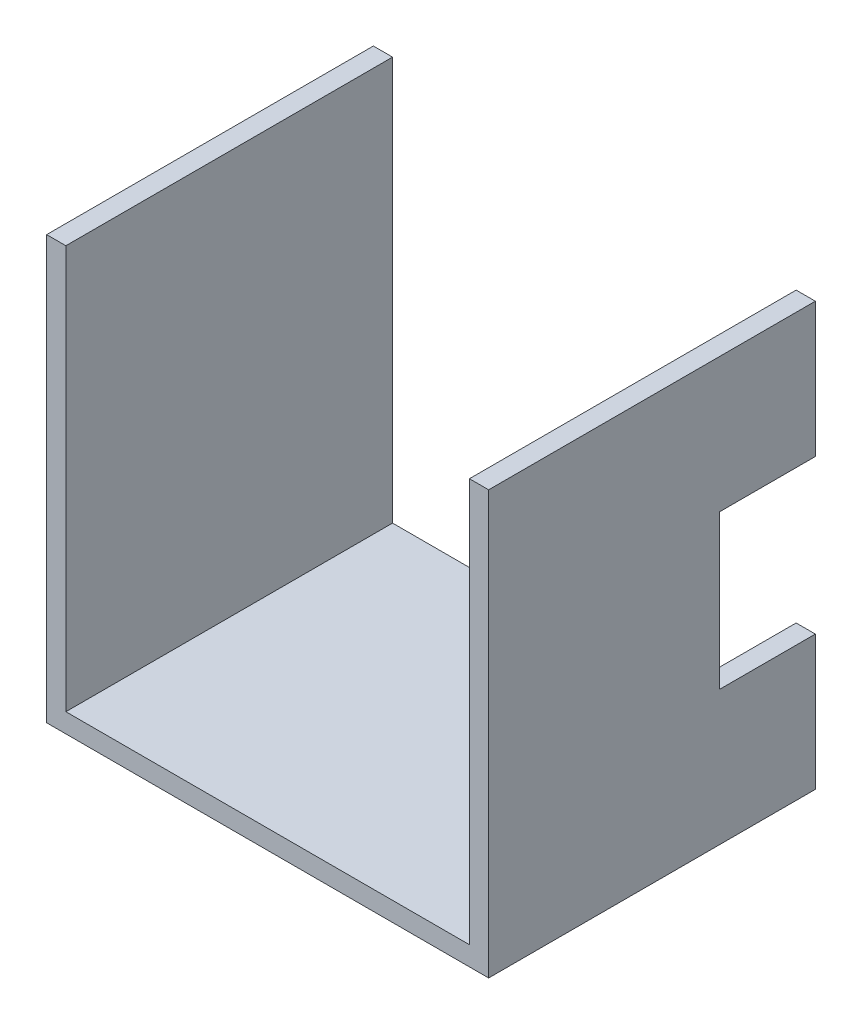
ISO-10303-21;
HEADER;
FILE_DESCRIPTION(('STEP AP214'),'2;1');
FILE_NAME('part.step','',(''),(''),'','','');
FILE_SCHEMA(('AUTOMOTIVE_DESIGN { 1 0 10303 214 1 1 1 1 }'));
ENDSEC;
DATA;
#1=APPLICATION_CONTEXT('core data for automotive mechanical design processes');
#2=APPLICATION_PROTOCOL_DEFINITION('international standard','automotive_design',2000,#1);
#3=PRODUCT_CONTEXT('',#1,'mechanical');
#4=PRODUCT('Part','Part','',(#3));
#5=PRODUCT_RELATED_PRODUCT_CATEGORY('part','',(#4));
#6=PRODUCT_DEFINITION_FORMATION('','',#4);
#7=PRODUCT_DEFINITION_CONTEXT('part definition',#1,'design');
#8=PRODUCT_DEFINITION('design','',#6,#7);
#9=PRODUCT_DEFINITION_SHAPE('','',#8);
#10=(LENGTH_UNIT() NAMED_UNIT(*) SI_UNIT(.MILLI.,.METRE.));
#11=(NAMED_UNIT(*) PLANE_ANGLE_UNIT() SI_UNIT($,.RADIAN.));
#12=(NAMED_UNIT(*) SI_UNIT($,.STERADIAN.) SOLID_ANGLE_UNIT());
#13=UNCERTAINTY_MEASURE_WITH_UNIT(LENGTH_MEASURE(1.E-05),#10,'distance_accuracy_value','');
#14=(GEOMETRIC_REPRESENTATION_CONTEXT(3) GLOBAL_UNCERTAINTY_ASSIGNED_CONTEXT((#13)) GLOBAL_UNIT_ASSIGNED_CONTEXT((#10,
#11,#12)) REPRESENTATION_CONTEXT('',''));
#15=CARTESIAN_POINT('',(0.,0.,0.));
#16=DIRECTION('',(0.,0.,1.));
#17=DIRECTION('',(1.,0.,0.));
#18=AXIS2_PLACEMENT_3D('',#15,#16,#17);
#19=CARTESIAN_POINT('',(0.,0.,0.));
#20=DIRECTION('',(0.,0.,1.));
#21=DIRECTION('',(1.,0.,0.));
#22=AXIS2_PLACEMENT_3D('',#19,#20,#21);
#23=PLANE('',#22);
#24=DIRECTION('',(0.,1.,0.));
#25=VECTOR('',#24,1.);
#26=CARTESIAN_POINT('',(44.,-1.99999999999999,0.));
#27=LINE('',#26,#25);
#28=CARTESIAN_POINT('',(44.,28.,0.));
#29=VERTEX_POINT('',#28);
#30=CARTESIAN_POINT('',(44.,42.,0.));
#31=VERTEX_POINT('',#30);
#32=EDGE_CURVE('E172',#29,#31,#27,.T.);
#33=ORIENTED_EDGE('',*,*,#32,.F.);
#34=DIRECTION('',(1.,0.,0.));
#35=VECTOR('',#34,1.);
#36=CARTESIAN_POINT('',(42.,28.,0.));
#37=LINE('',#36,#35);
#38=CARTESIAN_POINT('',(42.,28.,0.));
#39=VERTEX_POINT('',#38);
#40=EDGE_CURVE('E163',#39,#29,#37,.T.);
#41=ORIENTED_EDGE('',*,*,#40,.F.);
#42=DIRECTION('',(0.,-1.,0.));
#43=VECTOR('',#42,1.);
#44=CARTESIAN_POINT('',(42.,0.,0.));
#45=LINE('',#44,#43);
#46=CARTESIAN_POINT('',(42.,42.,0.));
#47=VERTEX_POINT('',#46);
#48=EDGE_CURVE('E180',#47,#39,#45,.T.);
#49=ORIENTED_EDGE('',*,*,#48,.F.);
#50=DIRECTION('',(-1.,0.,0.));
#51=VECTOR('',#50,1.);
#52=CARTESIAN_POINT('',(44.,42.,0.));
#53=LINE('',#52,#51);
#54=EDGE_CURVE('E142',#31,#47,#53,.T.);
#55=ORIENTED_EDGE('',*,*,#54,.F.);
#56=EDGE_LOOP('',(#33,#41,#49,#55));
#57=FACE_BOUND('',#56,.T.);
#58=ADVANCED_FACE('F43',(#57),#23,.F.);
#59=CARTESIAN_POINT('',(0.,0.,34.));
#60=DIRECTION('',(-1.,0.,0.));
#61=DIRECTION('',(0.,0.,1.));
#62=AXIS2_PLACEMENT_3D('',#59,#60,#61);
#63=PLANE('',#62);
#64=DIRECTION('',(0.,1.,0.));
#65=VECTOR('',#64,1.);
#66=CARTESIAN_POINT('',(0.,0.,0.));
#67=LINE('',#66,#65);
#68=CARTESIAN_POINT('',(0.,0.,0.));
#69=VERTEX_POINT('',#68);
#70=CARTESIAN_POINT('',(0.,42.,0.));
#71=VERTEX_POINT('',#70);
#72=EDGE_CURVE('E158',#69,#71,#67,.T.);
#73=ORIENTED_EDGE('',*,*,#72,.T.);
#74=DIRECTION('',(0.,0.,-1.));
#75=VECTOR('',#74,1.);
#76=CARTESIAN_POINT('',(0.,42.,34.));
#77=LINE('',#76,#75);
#78=CARTESIAN_POINT('',(0.,42.,34.));
#79=VERTEX_POINT('',#78);
#80=EDGE_CURVE('E11',#79,#71,#77,.T.);
#81=ORIENTED_EDGE('',*,*,#80,.F.);
#82=DIRECTION('',(0.,1.,0.));
#83=VECTOR('',#82,1.);
#84=CARTESIAN_POINT('',(0.,0.,34.));
#85=LINE('',#84,#83);
#86=CARTESIAN_POINT('',(0.,0.,34.));
#87=VERTEX_POINT('',#86);
#88=EDGE_CURVE('E185',#87,#79,#85,.T.);
#89=ORIENTED_EDGE('',*,*,#88,.F.);
#90=DIRECTION('',(0.,0.,-1.));
#91=VECTOR('',#90,1.);
#92=CARTESIAN_POINT('',(0.,0.,34.));
#93=LINE('',#92,#91);
#94=EDGE_CURVE('E154',#87,#69,#93,.T.);
#95=ORIENTED_EDGE('',*,*,#94,.T.);
#96=EDGE_LOOP('',(#73,#81,#89,#95));
#97=FACE_BOUND('',#96,.T.);
#98=ADVANCED_FACE('F45',(#97),#63,.F.);
#99=CARTESIAN_POINT('',(0.,42.,34.));
#100=DIRECTION('',(0.,-1.,0.));
#101=DIRECTION('',(0.,0.,-1.));
#102=AXIS2_PLACEMENT_3D('',#99,#100,#101);
#103=PLANE('',#102);
#104=DIRECTION('',(-1.,0.,0.));
#105=VECTOR('',#104,1.);
#106=CARTESIAN_POINT('',(0.,42.,0.));
#107=LINE('',#106,#105);
#108=CARTESIAN_POINT('',(-2.,42.,0.));
#109=VERTEX_POINT('',#108);
#110=EDGE_CURVE('E162',#71,#109,#107,.T.);
#111=ORIENTED_EDGE('',*,*,#110,.T.);
#112=DIRECTION('',(0.,0.,-1.));
#113=VECTOR('',#112,1.);
#114=CARTESIAN_POINT('',(-2.,42.,34.));
#115=LINE('',#114,#113);
#116=CARTESIAN_POINT('',(-2.,42.,34.));
#117=VERTEX_POINT('',#116);
#118=EDGE_CURVE('E52',#117,#109,#115,.T.);
#119=ORIENTED_EDGE('',*,*,#118,.F.);
#120=DIRECTION('',(-1.,0.,0.));
#121=VECTOR('',#120,1.);
#122=CARTESIAN_POINT('',(0.,42.,34.));
#123=LINE('',#122,#121);
#124=EDGE_CURVE('E109',#79,#117,#123,.T.);
#125=ORIENTED_EDGE('',*,*,#124,.F.);
#126=ORIENTED_EDGE('',*,*,#80,.T.);
#127=EDGE_LOOP('',(#111,#119,#125,#126));
#128=FACE_BOUND('',#127,.T.);
#129=ADVANCED_FACE('F287',(#128),#103,.F.);
#130=CARTESIAN_POINT('',(-2.,42.,34.));
#131=DIRECTION('',(1.,0.,0.));
#132=DIRECTION('',(0.,1.,0.));
#133=AXIS2_PLACEMENT_3D('',#130,#131,#132);
#134=PLANE('',#133);
#135=DIRECTION('',(0.,-1.,0.));
#136=VECTOR('',#135,1.);
#137=CARTESIAN_POINT('',(-2.,42.,0.));
#138=LINE('',#137,#136);
#139=CARTESIAN_POINT('',(-1.99999999999999,-1.99999999999999,0.));
#140=VERTEX_POINT('',#139);
#141=EDGE_CURVE('E166',#109,#140,#138,.T.);
#142=ORIENTED_EDGE('',*,*,#141,.T.);
#143=DIRECTION('',(0.,0.,-1.));
#144=VECTOR('',#143,1.);
#145=CARTESIAN_POINT('',(-1.99999999999999,-1.99999999999999,34.));
#146=LINE('',#145,#144);
#147=CARTESIAN_POINT('',(-1.99999999999999,-1.99999999999999,34.));
#148=VERTEX_POINT('',#147);
#149=EDGE_CURVE('E196',#148,#140,#146,.T.);
#150=ORIENTED_EDGE('',*,*,#149,.F.);
#151=DIRECTION('',(0.,-1.,0.));
#152=VECTOR('',#151,1.);
#153=CARTESIAN_POINT('',(-2.,42.,34.));
#154=LINE('',#153,#152);
#155=EDGE_CURVE('E206',#117,#148,#154,.T.);
#156=ORIENTED_EDGE('',*,*,#155,.F.);
#157=ORIENTED_EDGE('',*,*,#118,.T.);
#158=EDGE_LOOP('',(#142,#150,#156,#157));
#159=FACE_BOUND('',#158,.T.);
#160=ADVANCED_FACE('F204',(#159),#134,.F.);
#161=CARTESIAN_POINT('',(-1.99999999999999,-1.99999999999999,34.));
#162=DIRECTION('',(0.,1.,0.));
#163=DIRECTION('',(-1.,0.,0.));
#164=AXIS2_PLACEMENT_3D('',#161,#162,#163);
#165=PLANE('',#164);
#166=DIRECTION('',(1.,0.,0.));
#167=VECTOR('',#166,1.);
#168=CARTESIAN_POINT('',(-1.99999999999999,-1.99999999999999,0.));
#169=LINE('',#168,#167);
#170=CARTESIAN_POINT('',(44.,-1.99999999999999,0.));
#171=VERTEX_POINT('',#170);
#172=EDGE_CURVE('E169',#140,#171,#169,.T.);
#173=ORIENTED_EDGE('',*,*,#172,.T.);
#174=DIRECTION('',(0.,0.,-1.));
#175=VECTOR('',#174,1.);
#176=CARTESIAN_POINT('',(44.,-1.99999999999999,34.));
#177=LINE('',#176,#175);
#178=CARTESIAN_POINT('',(44.,-1.99999999999999,34.));
#179=VERTEX_POINT('',#178);
#180=EDGE_CURVE('E192',#179,#171,#177,.T.);
#181=ORIENTED_EDGE('',*,*,#180,.F.);
#182=DIRECTION('',(1.,0.,0.));
#183=VECTOR('',#182,1.);
#184=CARTESIAN_POINT('',(-1.99999999999999,-1.99999999999999,34.));
#185=LINE('',#184,#183);
#186=EDGE_CURVE('E221',#148,#179,#185,.T.);
#187=ORIENTED_EDGE('',*,*,#186,.F.);
#188=ORIENTED_EDGE('',*,*,#149,.T.);
#189=EDGE_LOOP('',(#173,#181,#187,#188));
#190=FACE_BOUND('',#189,.T.);
#191=ADVANCED_FACE('F215',(#190),#165,.F.);
#192=CARTESIAN_POINT('',(44.,-1.99999999999999,34.));
#193=DIRECTION('',(-1.,0.,0.));
#194=DIRECTION('',(0.,0.,1.));
#195=AXIS2_PLACEMENT_3D('',#192,#193,#194);
#196=PLANE('',#195);
#197=DIRECTION('',(0.,-1.,0.));
#198=VECTOR('',#197,1.);
#199=CARTESIAN_POINT('',(44.,28.,10.));
#200=LINE('',#199,#198);
#201=CARTESIAN_POINT('',(44.,28.,10.));
#202=VERTEX_POINT('',#201);
#203=CARTESIAN_POINT('',(44.,12.,10.));
#204=VERTEX_POINT('',#203);
#205=EDGE_CURVE('E248',#202,#204,#200,.T.);
#206=ORIENTED_EDGE('',*,*,#205,.F.);
#207=DIRECTION('',(0.,0.,1.));
#208=VECTOR('',#207,1.);
#209=CARTESIAN_POINT('',(44.,28.,0.));
#210=LINE('',#209,#208);
#211=EDGE_CURVE('E252',#29,#202,#210,.T.);
#212=ORIENTED_EDGE('',*,*,#211,.F.);
#213=ORIENTED_EDGE('',*,*,#32,.T.);
#214=DIRECTION('',(0.,0.,-1.));
#215=VECTOR('',#214,1.);
#216=CARTESIAN_POINT('',(44.,42.,34.));
#217=LINE('',#216,#215);
#218=CARTESIAN_POINT('',(44.,42.,34.));
#219=VERTEX_POINT('',#218);
#220=EDGE_CURVE('E147',#219,#31,#217,.T.);
#221=ORIENTED_EDGE('',*,*,#220,.F.);
#222=DIRECTION('',(0.,1.,0.));
#223=VECTOR('',#222,1.);
#224=CARTESIAN_POINT('',(44.,-1.99999999999999,34.));
#225=LINE('',#224,#223);
#226=EDGE_CURVE('E132',#179,#219,#225,.T.);
#227=ORIENTED_EDGE('',*,*,#226,.F.);
#228=ORIENTED_EDGE('',*,*,#180,.T.);
#229=CARTESIAN_POINT('',(44.,12.,0.));
#230=VERTEX_POINT('',#229);
#231=EDGE_CURVE('E173',#171,#230,#27,.T.);
#232=ORIENTED_EDGE('',*,*,#231,.T.);
#233=DIRECTION('',(0.,0.,-1.));
#234=VECTOR('',#233,1.);
#235=CARTESIAN_POINT('',(44.,12.,10.));
#236=LINE('',#235,#234);
#237=EDGE_CURVE('E59',#204,#230,#236,.T.);
#238=ORIENTED_EDGE('',*,*,#237,.F.);
#239=EDGE_LOOP('',(#206,#212,#213,#221,#227,#228,#232,#238));
#240=FACE_BOUND('',#239,.T.);
#241=ADVANCED_FACE('F219',(#240),#196,.F.);
#242=CARTESIAN_POINT('',(44.,42.,34.));
#243=DIRECTION('',(0.,-1.,0.));
#244=DIRECTION('',(1.,0.,0.));
#245=AXIS2_PLACEMENT_3D('',#242,#243,#244);
#246=PLANE('',#245);
#247=ORIENTED_EDGE('',*,*,#54,.T.);
#248=DIRECTION('',(0.,0.,-1.));
#249=VECTOR('',#248,1.);
#250=CARTESIAN_POINT('',(42.,42.,34.));
#251=LINE('',#250,#249);
#252=CARTESIAN_POINT('',(42.,42.,34.));
#253=VERTEX_POINT('',#252);
#254=EDGE_CURVE('E139',#253,#47,#251,.T.);
#255=ORIENTED_EDGE('',*,*,#254,.F.);
#256=DIRECTION('',(-1.,0.,0.));
#257=VECTOR('',#256,1.);
#258=CARTESIAN_POINT('',(44.,42.,34.));
#259=LINE('',#258,#257);
#260=EDGE_CURVE('E125',#219,#253,#259,.T.);
#261=ORIENTED_EDGE('',*,*,#260,.F.);
#262=ORIENTED_EDGE('',*,*,#220,.T.);
#263=EDGE_LOOP('',(#247,#255,#261,#262));
#264=FACE_BOUND('',#263,.T.);
#265=ADVANCED_FACE('F140',(#264),#246,.F.);
#266=CARTESIAN_POINT('',(42.,0.,34.));
#267=DIRECTION('',(1.,0.,0.));
#268=DIRECTION('',(0.,0.,-1.));
#269=AXIS2_PLACEMENT_3D('',#266,#267,#268);
#270=PLANE('',#269);
#271=ORIENTED_EDGE('',*,*,#48,.T.);
#272=DIRECTION('',(0.,0.,1.));
#273=VECTOR('',#272,1.);
#274=CARTESIAN_POINT('',(42.,28.,0.));
#275=LINE('',#274,#273);
#276=CARTESIAN_POINT('',(42.,28.,10.));
#277=VERTEX_POINT('',#276);
#278=EDGE_CURVE('E247',#39,#277,#275,.T.);
#279=ORIENTED_EDGE('',*,*,#278,.T.);
#280=DIRECTION('',(0.,-1.,0.));
#281=VECTOR('',#280,1.);
#282=CARTESIAN_POINT('',(42.,28.,10.));
#283=LINE('',#282,#281);
#284=CARTESIAN_POINT('',(42.,12.,10.));
#285=VERTEX_POINT('',#284);
#286=EDGE_CURVE('E259',#277,#285,#283,.T.);
#287=ORIENTED_EDGE('',*,*,#286,.T.);
#288=DIRECTION('',(0.,0.,-1.));
#289=VECTOR('',#288,1.);
#290=CARTESIAN_POINT('',(42.,12.,10.));
#291=LINE('',#290,#289);
#292=CARTESIAN_POINT('',(42.,12.,0.));
#293=VERTEX_POINT('',#292);
#294=EDGE_CURVE('E236',#285,#293,#291,.T.);
#295=ORIENTED_EDGE('',*,*,#294,.T.);
#296=CARTESIAN_POINT('',(42.,0.,0.));
#297=VERTEX_POINT('',#296);
#298=EDGE_CURVE('E179',#293,#297,#45,.T.);
#299=ORIENTED_EDGE('',*,*,#298,.T.);
#300=DIRECTION('',(0.,0.,-1.));
#301=VECTOR('',#300,1.);
#302=CARTESIAN_POINT('',(42.,0.,34.));
#303=LINE('',#302,#301);
#304=CARTESIAN_POINT('',(42.,0.,34.));
#305=VERTEX_POINT('',#304);
#306=EDGE_CURVE('E148',#305,#297,#303,.T.);
#307=ORIENTED_EDGE('',*,*,#306,.F.);
#308=DIRECTION('',(0.,-1.,0.));
#309=VECTOR('',#308,1.);
#310=CARTESIAN_POINT('',(42.,0.,34.));
#311=LINE('',#310,#309);
#312=EDGE_CURVE('E129',#253,#305,#311,.T.);
#313=ORIENTED_EDGE('',*,*,#312,.F.);
#314=ORIENTED_EDGE('',*,*,#254,.T.);
#315=EDGE_LOOP('',(#271,#279,#287,#295,#299,#307,#313,#314));
#316=FACE_BOUND('',#315,.T.);
#317=ADVANCED_FACE('F150',(#316),#270,.F.);
#318=CARTESIAN_POINT('',(0.,0.,34.));
#319=DIRECTION('',(0.,-1.,0.));
#320=DIRECTION('',(0.,0.,-1.));
#321=AXIS2_PLACEMENT_3D('',#318,#319,#320);
#322=PLANE('',#321);
#323=DIRECTION('',(-1.,0.,0.));
#324=VECTOR('',#323,1.);
#325=CARTESIAN_POINT('',(0.,0.,0.));
#326=LINE('',#325,#324);
#327=EDGE_CURVE('E101',#297,#69,#326,.T.);
#328=ORIENTED_EDGE('',*,*,#327,.T.);
#329=ORIENTED_EDGE('',*,*,#94,.F.);
#330=DIRECTION('',(-1.,0.,0.));
#331=VECTOR('',#330,1.);
#332=CARTESIAN_POINT('',(0.,0.,34.));
#333=LINE('',#332,#331);
#334=EDGE_CURVE('E68',#305,#87,#333,.T.);
#335=ORIENTED_EDGE('',*,*,#334,.F.);
#336=ORIENTED_EDGE('',*,*,#306,.T.);
#337=EDGE_LOOP('',(#328,#329,#335,#336));
#338=FACE_BOUND('',#337,.T.);
#339=ADVANCED_FACE('F283',(#338),#322,.F.);
#340=CARTESIAN_POINT('',(0.,0.,34.));
#341=DIRECTION('',(0.,0.,1.));
#342=DIRECTION('',(1.,0.,0.));
#343=AXIS2_PLACEMENT_3D('',#340,#341,#342);
#344=PLANE('',#343);
#345=ORIENTED_EDGE('',*,*,#88,.T.);
#346=ORIENTED_EDGE('',*,*,#124,.T.);
#347=ORIENTED_EDGE('',*,*,#155,.T.);
#348=ORIENTED_EDGE('',*,*,#186,.T.);
#349=ORIENTED_EDGE('',*,*,#226,.T.);
#350=ORIENTED_EDGE('',*,*,#260,.T.);
#351=ORIENTED_EDGE('',*,*,#312,.T.);
#352=ORIENTED_EDGE('',*,*,#334,.T.);
#353=EDGE_LOOP('',(#345,#346,#347,#348,#349,#350,#351,#352));
#354=FACE_BOUND('',#353,.T.);
#355=ADVANCED_FACE('F127',(#354),#344,.T.);
#356=ORIENTED_EDGE('',*,*,#298,.F.);
#357=DIRECTION('',(1.,0.,0.));
#358=VECTOR('',#357,1.);
#359=CARTESIAN_POINT('',(42.,12.,0.));
#360=LINE('',#359,#358);
#361=EDGE_CURVE('E239',#293,#230,#360,.T.);
#362=ORIENTED_EDGE('',*,*,#361,.T.);
#363=ORIENTED_EDGE('',*,*,#231,.F.);
#364=ORIENTED_EDGE('',*,*,#172,.F.);
#365=ORIENTED_EDGE('',*,*,#141,.F.);
#366=ORIENTED_EDGE('',*,*,#110,.F.);
#367=ORIENTED_EDGE('',*,*,#72,.F.);
#368=ORIENTED_EDGE('',*,*,#327,.F.);
#369=EDGE_LOOP('',(#356,#362,#363,#364,#365,#366,#367,#368));
#370=FACE_BOUND('',#369,.T.);
#371=ADVANCED_FACE('F210',(#370),#23,.F.);
#372=CARTESIAN_POINT('',(42.,28.,0.));
#373=DIRECTION('',(0.,1.,0.));
#374=DIRECTION('',(0.,0.,1.));
#375=AXIS2_PLACEMENT_3D('',#372,#373,#374);
#376=PLANE('',#375);
#377=ORIENTED_EDGE('',*,*,#211,.T.);
#378=DIRECTION('',(1.,0.,0.));
#379=VECTOR('',#378,1.);
#380=CARTESIAN_POINT('',(42.,28.,10.));
#381=LINE('',#380,#379);
#382=EDGE_CURVE('E231',#277,#202,#381,.T.);
#383=ORIENTED_EDGE('',*,*,#382,.F.);
#384=ORIENTED_EDGE('',*,*,#278,.F.);
#385=ORIENTED_EDGE('',*,*,#40,.T.);
#386=EDGE_LOOP('',(#377,#383,#384,#385));
#387=FACE_BOUND('',#386,.T.);
#388=ADVANCED_FACE('F273',(#387),#376,.F.);
#389=CARTESIAN_POINT('',(42.,12.,10.));
#390=DIRECTION('',(0.,-1.,0.));
#391=DIRECTION('',(0.,0.,-1.));
#392=AXIS2_PLACEMENT_3D('',#389,#390,#391);
#393=PLANE('',#392);
#394=ORIENTED_EDGE('',*,*,#237,.T.);
#395=ORIENTED_EDGE('',*,*,#361,.F.);
#396=ORIENTED_EDGE('',*,*,#294,.F.);
#397=DIRECTION('',(1.,0.,0.));
#398=VECTOR('',#397,1.);
#399=CARTESIAN_POINT('',(42.,12.,10.));
#400=LINE('',#399,#398);
#401=EDGE_CURVE('E235',#285,#204,#400,.T.);
#402=ORIENTED_EDGE('',*,*,#401,.T.);
#403=EDGE_LOOP('',(#394,#395,#396,#402));
#404=FACE_BOUND('',#403,.T.);
#405=ADVANCED_FACE('F305',(#404),#393,.F.);
#406=CARTESIAN_POINT('',(42.,28.,10.));
#407=DIRECTION('',(0.,0.,1.));
#408=DIRECTION('',(0.,-1.,0.));
#409=AXIS2_PLACEMENT_3D('',#406,#407,#408);
#410=PLANE('',#409);
#411=ORIENTED_EDGE('',*,*,#205,.T.);
#412=ORIENTED_EDGE('',*,*,#401,.F.);
#413=ORIENTED_EDGE('',*,*,#286,.F.);
#414=ORIENTED_EDGE('',*,*,#382,.T.);
#415=EDGE_LOOP('',(#411,#412,#413,#414));
#416=FACE_BOUND('',#415,.T.);
#417=ADVANCED_FACE('F311',(#416),#410,.F.);
#418=CLOSED_SHELL('',(#58,#98,#129,#160,#191,#241,#265,#317,#339,#355,#371,#388,#405,#417));
#419=MANIFOLD_SOLID_BREP('B2',#418);
#420=ADVANCED_BREP_SHAPE_REPRESENTATION('',(#18,#419),#14);
#421=SHAPE_DEFINITION_REPRESENTATION(#9,#420);
ENDSEC;
END-ISO-10303-21;
